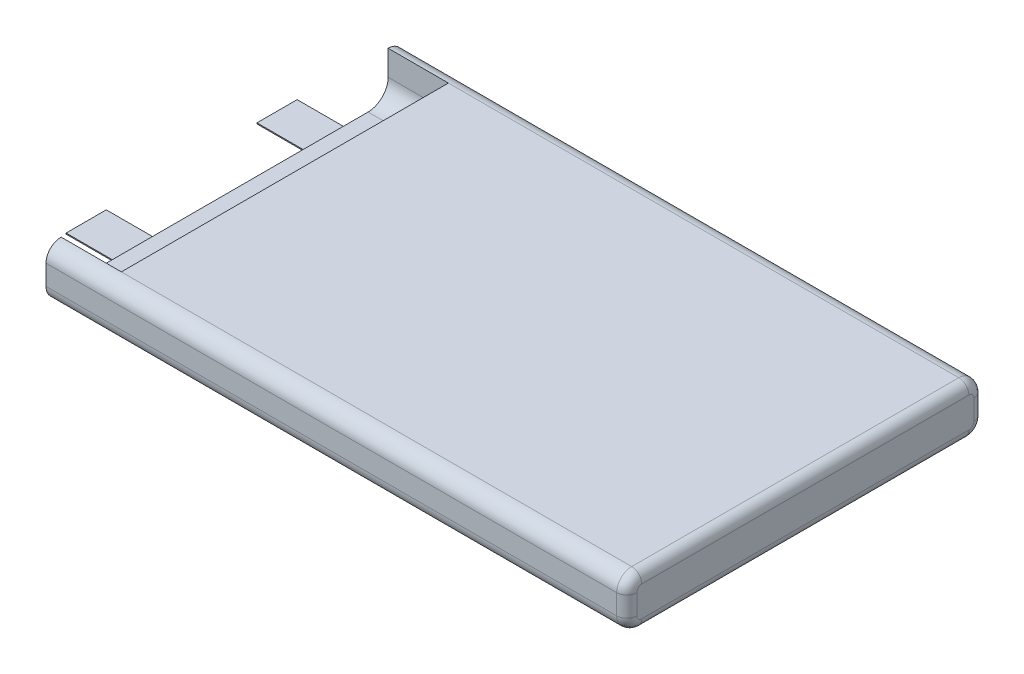
ISO-10303-21;
HEADER;
FILE_DESCRIPTION(('STEP AP214'),'2;1');
FILE_NAME('part.step','',(''),(''),'','','');
FILE_SCHEMA(('AUTOMOTIVE_DESIGN { 1 0 10303 214 1 1 1 1 }'));
ENDSEC;
DATA;
#1=APPLICATION_CONTEXT('core data for automotive mechanical design processes');
#2=APPLICATION_PROTOCOL_DEFINITION('international standard','automotive_design',2000,#1);
#3=PRODUCT_CONTEXT('',#1,'mechanical');
#4=PRODUCT('Part','Part','',(#3));
#5=PRODUCT_RELATED_PRODUCT_CATEGORY('part','',(#4));
#6=PRODUCT_DEFINITION_FORMATION('','',#4);
#7=PRODUCT_DEFINITION_CONTEXT('part definition',#1,'design');
#8=PRODUCT_DEFINITION('design','',#6,#7);
#9=PRODUCT_DEFINITION_SHAPE('','',#8);
#10=(LENGTH_UNIT() NAMED_UNIT(*) SI_UNIT(.MILLI.,.METRE.));
#11=(NAMED_UNIT(*) PLANE_ANGLE_UNIT() SI_UNIT($,.RADIAN.));
#12=(NAMED_UNIT(*) SI_UNIT($,.STERADIAN.) SOLID_ANGLE_UNIT());
#13=UNCERTAINTY_MEASURE_WITH_UNIT(LENGTH_MEASURE(1.E-05),#10,'distance_accuracy_value','');
#14=(GEOMETRIC_REPRESENTATION_CONTEXT(3) GLOBAL_UNCERTAINTY_ASSIGNED_CONTEXT((#13)) GLOBAL_UNIT_ASSIGNED_CONTEXT((#10,
#11,#12)) REPRESENTATION_CONTEXT('',''));
#15=CARTESIAN_POINT('',(0.,0.,0.));
#16=DIRECTION('',(0.,0.,1.));
#17=DIRECTION('',(1.,0.,0.));
#18=AXIS2_PLACEMENT_3D('',#15,#16,#17);
#19=CARTESIAN_POINT('',(0.,0.,6.78));
#20=DIRECTION('',(0.,-1.,0.));
#21=DIRECTION('',(0.,0.,-1.));
#22=AXIS2_PLACEMENT_3D('',#19,#20,#21);
#23=PLANE('',#22);
#24=DIRECTION('',(0.,0.,1.));
#25=VECTOR('',#24,1.);
#26=CARTESIAN_POINT('',(-5.,0.,6.78));
#27=LINE('',#26,#25);
#28=CARTESIAN_POINT('',(-5.,0.,6.78));
#29=VERTEX_POINT('',#28);
#30=CARTESIAN_POINT('',(-5.,0.,10.78));
#31=VERTEX_POINT('',#30);
#32=EDGE_CURVE('P0_E58',#29,#31,#27,.T.);
#33=ORIENTED_EDGE('',*,*,#32,.F.);
#34=DIRECTION('',(-1.,0.,0.));
#35=VECTOR('',#34,1.);
#36=CARTESIAN_POINT('',(0.,0.,6.78));
#37=LINE('',#36,#35);
#38=CARTESIAN_POINT('',(0.,0.,6.78));
#39=VERTEX_POINT('',#38);
#40=EDGE_CURVE('P0_E53',#39,#29,#37,.T.);
#41=ORIENTED_EDGE('',*,*,#40,.F.);
#42=DIRECTION('',(0.,0.,-1.));
#43=VECTOR('',#42,1.);
#44=CARTESIAN_POINT('',(0.,0.,6.78));
#45=LINE('',#44,#43);
#46=CARTESIAN_POINT('',(0.,0.,10.78));
#47=VERTEX_POINT('',#46);
#48=EDGE_CURVE('P0_E68',#47,#39,#45,.T.);
#49=ORIENTED_EDGE('',*,*,#48,.F.);
#50=DIRECTION('',(1.,0.,0.));
#51=VECTOR('',#50,1.);
#52=CARTESIAN_POINT('',(0.,0.,10.78));
#53=LINE('',#52,#51);
#54=EDGE_CURVE('P0_E20',#31,#47,#53,.T.);
#55=ORIENTED_EDGE('',*,*,#54,.F.);
#56=EDGE_LOOP('',(#33,#41,#49,#55));
#57=FACE_BOUND('',#56,.T.);
#58=ADVANCED_FACE('P0_F17',(#57),#23,.T.);
#59=CARTESIAN_POINT('',(0.,0.1,10.78));
#60=DIRECTION('',(0.,0.,1.));
#61=DIRECTION('',(1.,0.,0.));
#62=AXIS2_PLACEMENT_3D('',#59,#60,#61);
#63=PLANE('',#62);
#64=DIRECTION('',(1.,0.,0.));
#65=VECTOR('',#64,1.);
#66=CARTESIAN_POINT('',(0.,0.1,10.78));
#67=LINE('',#66,#65);
#68=CARTESIAN_POINT('',(0.,0.1,10.78));
#69=VERTEX_POINT('',#68);
#70=CARTESIAN_POINT('',(-5.,0.1,10.78));
#71=VERTEX_POINT('',#70);
#72=EDGE_CURVE('P0_E74',#69,#71,#67,.F.);
#73=ORIENTED_EDGE('',*,*,#72,.T.);
#74=DIRECTION('',(0.,1.,0.));
#75=VECTOR('',#74,1.);
#76=CARTESIAN_POINT('',(-5.,0.1,10.78));
#77=LINE('',#76,#75);
#78=EDGE_CURVE('P0_E63',#31,#71,#77,.T.);
#79=ORIENTED_EDGE('',*,*,#78,.F.);
#80=ORIENTED_EDGE('',*,*,#54,.T.);
#81=DIRECTION('',(0.,1.,0.));
#82=VECTOR('',#81,1.);
#83=CARTESIAN_POINT('',(0.,0.1,10.78));
#84=LINE('',#83,#82);
#85=EDGE_CURVE('P0_E81',#69,#47,#84,.F.);
#86=ORIENTED_EDGE('',*,*,#85,.F.);
#87=EDGE_LOOP('',(#73,#79,#80,#86));
#88=FACE_BOUND('',#87,.T.);
#89=ADVANCED_FACE('P0_F73',(#88),#63,.T.);
#90=CARTESIAN_POINT('',(-5.,0.1,6.78));
#91=DIRECTION('',(-1.,0.,0.));
#92=DIRECTION('',(0.,0.,1.));
#93=AXIS2_PLACEMENT_3D('',#90,#91,#92);
#94=PLANE('',#93);
#95=DIRECTION('',(0.,0.,-1.));
#96=VECTOR('',#95,1.);
#97=CARTESIAN_POINT('',(-5.,0.1,6.78));
#98=LINE('',#97,#96);
#99=CARTESIAN_POINT('',(-5.,0.1,6.78));
#100=VERTEX_POINT('',#99);
#101=EDGE_CURVE('P0_E84',#71,#100,#98,.T.);
#102=ORIENTED_EDGE('',*,*,#101,.T.);
#103=DIRECTION('',(0.,1.,0.));
#104=VECTOR('',#103,1.);
#105=CARTESIAN_POINT('',(-5.,0.1,6.78));
#106=LINE('',#105,#104);
#107=EDGE_CURVE('P0_E65',#29,#100,#106,.T.);
#108=ORIENTED_EDGE('',*,*,#107,.F.);
#109=ORIENTED_EDGE('',*,*,#32,.T.);
#110=ORIENTED_EDGE('',*,*,#78,.T.);
#111=EDGE_LOOP('',(#102,#108,#109,#110));
#112=FACE_BOUND('',#111,.T.);
#113=ADVANCED_FACE('P0_F61',(#112),#94,.T.);
#114=CARTESIAN_POINT('',(0.,0.1,6.78));
#115=DIRECTION('',(0.,0.,-1.));
#116=DIRECTION('',(-1.,0.,0.));
#117=AXIS2_PLACEMENT_3D('',#114,#115,#116);
#118=PLANE('',#117);
#119=DIRECTION('',(1.,0.,0.));
#120=VECTOR('',#119,1.);
#121=CARTESIAN_POINT('',(0.,0.1,6.78));
#122=LINE('',#121,#120);
#123=CARTESIAN_POINT('',(0.,0.1,6.78));
#124=VERTEX_POINT('',#123);
#125=EDGE_CURVE('P0_E26',#100,#124,#122,.T.);
#126=ORIENTED_EDGE('',*,*,#125,.T.);
#127=DIRECTION('',(0.,1.,0.));
#128=VECTOR('',#127,1.);
#129=CARTESIAN_POINT('',(0.,0.1,6.78));
#130=LINE('',#129,#128);
#131=EDGE_CURVE('P0_E34',#39,#124,#130,.T.);
#132=ORIENTED_EDGE('',*,*,#131,.F.);
#133=ORIENTED_EDGE('',*,*,#40,.T.);
#134=ORIENTED_EDGE('',*,*,#107,.T.);
#135=EDGE_LOOP('',(#126,#132,#133,#134));
#136=FACE_BOUND('',#135,.T.);
#137=ADVANCED_FACE('P0_F88',(#136),#118,.T.);
#138=CARTESIAN_POINT('',(0.,0.1,6.78));
#139=DIRECTION('',(1.,0.,0.));
#140=DIRECTION('',(0.,0.,-1.));
#141=AXIS2_PLACEMENT_3D('',#138,#139,#140);
#142=PLANE('',#141);
#143=DIRECTION('',(0.,0.,-1.));
#144=VECTOR('',#143,1.);
#145=CARTESIAN_POINT('',(0.,0.1,6.78));
#146=LINE('',#145,#144);
#147=EDGE_CURVE('P0_E11',#124,#69,#146,.F.);
#148=ORIENTED_EDGE('',*,*,#147,.T.);
#149=ORIENTED_EDGE('',*,*,#85,.T.);
#150=ORIENTED_EDGE('',*,*,#48,.T.);
#151=ORIENTED_EDGE('',*,*,#131,.T.);
#152=EDGE_LOOP('',(#148,#149,#150,#151));
#153=FACE_BOUND('',#152,.T.);
#154=ADVANCED_FACE('P0_F91',(#153),#142,.T.);
#155=CARTESIAN_POINT('',(0.,0.1,6.78));
#156=DIRECTION('',(0.,-1.,0.));
#157=DIRECTION('',(0.,0.,-1.));
#158=AXIS2_PLACEMENT_3D('',#155,#156,#157);
#159=PLANE('',#158);
#160=ORIENTED_EDGE('',*,*,#125,.F.);
#161=ORIENTED_EDGE('',*,*,#101,.F.);
#162=ORIENTED_EDGE('',*,*,#72,.F.);
#163=ORIENTED_EDGE('',*,*,#147,.F.);
#164=EDGE_LOOP('',(#160,#161,#162,#163));
#165=FACE_BOUND('',#164,.T.);
#166=ADVANCED_FACE('P0_F90',(#165),#159,.F.);
#167=CLOSED_SHELL('',(#58,#89,#113,#137,#154,#166));
#168=MANIFOLD_SOLID_BREP('P0_B1',#167);
#169=CARTESIAN_POINT('',(56.81,3.5,16.78));
#170=DIRECTION('',(0.,1.,0.));
#171=DIRECTION('',(0.,0.,1.));
#172=AXIS2_PLACEMENT_3D('',#169,#170,#171);
#173=CIRCLE('',#172,1.);
#174=TRIMMED_CURVE('',#173,(PARAMETER_VALUE(-2.0943951023932)),
(PARAMETER_VALUE(2.0943951023932)),.T.,.PARAMETER.);
#175=CARTESIAN_POINT('',(56.81,3.5,16.28));
#176=DIRECTION('',(-1.,0.,0.));
#177=AXIS1_PLACEMENT('',#175,#176);
#178=SURFACE_OF_REVOLUTION('',#174,#177);
#179=CARTESIAN_POINT('',(56.81,3.5,16.78));
#180=DIRECTION('',(0.,-1.,0.));
#181=DIRECTION('',(0.,0.,-1.));
#182=AXIS2_PLACEMENT_3D('',#179,#180,#181);
#183=CIRCLE('',#182,1.);
#184=CARTESIAN_POINT('',(57.81,3.5,16.78));
#185=VERTEX_POINT('',#184);
#186=CARTESIAN_POINT('',(56.81,3.5,17.78));
#187=VERTEX_POINT('',#186);
#188=EDGE_CURVE('P1_E174',#185,#187,#183,.T.);
#189=ORIENTED_EDGE('',*,*,#188,.F.);
#190=CARTESIAN_POINT('',(57.81,3.5,16.28));
#191=DIRECTION('',(-1.,0.,0.));
#192=DIRECTION('',(0.,0.,1.));
#193=AXIS2_PLACEMENT_3D('',#190,#191,#192);
#194=CIRCLE('',#193,0.5);
#195=CARTESIAN_POINT('',(57.81,4.,16.28));
#196=VERTEX_POINT('',#195);
#197=EDGE_CURVE('P1_E212',#185,#196,#194,.T.);
#198=ORIENTED_EDGE('',*,*,#197,.T.);
#199=CARTESIAN_POINT('',(56.81,4.,16.28));
#200=DIRECTION('',(0.,0.,1.));
#201=DIRECTION('',(1.,0.,0.));
#202=AXIS2_PLACEMENT_3D('',#199,#200,#201);
#203=CIRCLE('',#202,1.);
#204=CARTESIAN_POINT('',(56.81,5.,16.28));
#205=VERTEX_POINT('',#204);
#206=EDGE_CURVE('P1_E746',#205,#196,#203,.F.);
#207=ORIENTED_EDGE('',*,*,#206,.F.);
#208=CARTESIAN_POINT('',(56.81,3.5,16.28));
#209=DIRECTION('',(-1.,0.,0.));
#210=DIRECTION('',(0.,0.,1.));
#211=AXIS2_PLACEMENT_3D('',#208,#209,#210);
#212=CIRCLE('',#211,1.5);
#213=EDGE_CURVE('P1_E411',#187,#205,#212,.T.);
#214=ORIENTED_EDGE('',*,*,#213,.F.);
#215=EDGE_LOOP('',(#189,#198,#207,#214));
#216=FACE_BOUND('',#215,.T.);
#217=ADVANCED_FACE('P1_F17',(#216),#178,.F.);
#218=CARTESIAN_POINT('',(0.,5.,17.78));
#219=DIRECTION('',(0.,1.,0.));
#220=DIRECTION('',(0.,0.,1.));
#221=AXIS2_PLACEMENT_3D('',#218,#219,#220);
#222=PLANE('',#221);
#223=DIRECTION('',(1.,0.,0.));
#224=VECTOR('',#223,1.);
#225=CARTESIAN_POINT('',(0.,5.,-16.28));
#226=LINE('',#225,#224);
#227=CARTESIAN_POINT('',(6.00000000000001,5.,-16.28));
#228=VERTEX_POINT('',#227);
#229=CARTESIAN_POINT('',(56.81,5.,-16.28));
#230=VERTEX_POINT('',#229);
#231=EDGE_CURVE('P1_E178',#228,#230,#226,.T.);
#232=ORIENTED_EDGE('',*,*,#231,.F.);
#233=DIRECTION('',(0.,0.,-1.));
#234=VECTOR('',#233,1.);
#235=CARTESIAN_POINT('',(6.,5.,-16.28));
#236=LINE('',#235,#234);
#237=CARTESIAN_POINT('',(6.00000000000001,5.,16.28));
#238=VERTEX_POINT('',#237);
#239=EDGE_CURVE('P1_E172',#228,#238,#236,.F.);
#240=ORIENTED_EDGE('',*,*,#239,.T.);
#241=DIRECTION('',(-1.,0.,0.));
#242=VECTOR('',#241,1.);
#243=CARTESIAN_POINT('',(0.,5.,16.28));
#244=LINE('',#243,#242);
#245=EDGE_CURVE('P1_E268',#205,#238,#244,.T.);
#246=ORIENTED_EDGE('',*,*,#245,.F.);
#247=DIRECTION('',(0.,0.,1.));
#248=VECTOR('',#247,1.);
#249=CARTESIAN_POINT('',(56.81,5.,17.78));
#250=LINE('',#249,#248);
#251=EDGE_CURVE('P1_E754',#230,#205,#250,.T.);
#252=ORIENTED_EDGE('',*,*,#251,.F.);
#253=EDGE_LOOP('',(#232,#240,#246,#252));
#254=FACE_BOUND('',#253,.T.);
#255=ADVANCED_FACE('P1_F194',(#254),#222,.T.);
#256=CARTESIAN_POINT('',(56.81,3.5,-15.78));
#257=DIRECTION('',(0.,1.,0.));
#258=DIRECTION('',(0.,0.,1.));
#259=AXIS2_PLACEMENT_3D('',#256,#257,#258);
#260=CIRCLE('',#259,1.);
#261=TRIMMED_CURVE('',#260,(PARAMETER_VALUE(-2.0943951023932)),
(PARAMETER_VALUE(2.0943951023932)),.T.,.PARAMETER.);
#262=CARTESIAN_POINT('',(56.81,3.5,-16.28));
#263=DIRECTION('',(-1.,0.,0.));
#264=AXIS1_PLACEMENT('',#262,#263);
#265=SURFACE_OF_REVOLUTION('',#261,#264);
#266=CARTESIAN_POINT('',(56.81,4.,-16.28));
#267=DIRECTION('',(0.,0.,1.));
#268=DIRECTION('',(1.,0.,0.));
#269=AXIS2_PLACEMENT_3D('',#266,#267,#268);
#270=CIRCLE('',#269,1.);
#271=CARTESIAN_POINT('',(57.81,4.,-16.28));
#272=VERTEX_POINT('',#271);
#273=EDGE_CURVE('P1_E739',#272,#230,#270,.T.);
#274=ORIENTED_EDGE('',*,*,#273,.F.);
#275=CARTESIAN_POINT('',(57.81,3.5,-16.28));
#276=DIRECTION('',(-1.,0.,0.));
#277=DIRECTION('',(0.,1.,0.));
#278=AXIS2_PLACEMENT_3D('',#275,#276,#277);
#279=CIRCLE('',#278,0.5);
#280=CARTESIAN_POINT('',(57.81,3.5,-16.78));
#281=VERTEX_POINT('',#280);
#282=EDGE_CURVE('P1_E175',#272,#281,#279,.T.);
#283=ORIENTED_EDGE('',*,*,#282,.T.);
#284=CARTESIAN_POINT('',(56.81,3.5,-16.78));
#285=DIRECTION('',(0.,-1.,0.));
#286=DIRECTION('',(0.,0.,-1.));
#287=AXIS2_PLACEMENT_3D('',#284,#285,#286);
#288=CIRCLE('',#287,1.);
#289=CARTESIAN_POINT('',(56.81,3.5,-17.78));
#290=VERTEX_POINT('',#289);
#291=EDGE_CURVE('P1_E146',#290,#281,#288,.T.);
#292=ORIENTED_EDGE('',*,*,#291,.F.);
#293=CARTESIAN_POINT('',(56.81,3.5,-16.28));
#294=DIRECTION('',(1.,0.,0.));
#295=DIRECTION('',(0.,0.,-1.));
#296=AXIS2_PLACEMENT_3D('',#293,#294,#295);
#297=CIRCLE('',#296,1.5);
#298=EDGE_CURVE('P1_E181',#230,#290,#297,.F.);
#299=ORIENTED_EDGE('',*,*,#298,.F.);
#300=EDGE_LOOP('',(#274,#283,#292,#299));
#301=FACE_BOUND('',#300,.T.);
#302=ADVANCED_FACE('P1_F190',(#301),#265,.F.);
#303=CARTESIAN_POINT('',(6.,0.5,-16.28));
#304=DIRECTION('',(1.,0.,0.));
#305=DIRECTION('',(0.,0.,-1.));
#306=AXIS2_PLACEMENT_3D('',#303,#304,#305);
#307=PLANE('',#306);
#308=CARTESIAN_POINT('',(6.00000000000001,2.5,14.28));
#309=DIRECTION('',(1.,0.,0.));
#310=DIRECTION('',(0.,0.,-1.));
#311=AXIS2_PLACEMENT_3D('',#308,#309,#310);
#312=CIRCLE('',#311,2.);
#313=CARTESIAN_POINT('',(6.00000000000001,0.5,14.28));
#314=VERTEX_POINT('',#313);
#315=CARTESIAN_POINT('',(6.00000000000001,2.5,16.28));
#316=VERTEX_POINT('',#315);
#317=EDGE_CURVE('P1_E22',#314,#316,#312,.F.);
#318=ORIENTED_EDGE('',*,*,#317,.T.);
#319=DIRECTION('',(0.,1.,0.));
#320=VECTOR('',#319,1.);
#321=CARTESIAN_POINT('',(6.00000000000001,0.5,16.28));
#322=LINE('',#321,#320);
#323=EDGE_CURVE('P1_E187',#316,#238,#322,.T.);
#324=ORIENTED_EDGE('',*,*,#323,.T.);
#325=ORIENTED_EDGE('',*,*,#239,.F.);
#326=DIRECTION('',(0.,1.,0.));
#327=VECTOR('',#326,1.);
#328=CARTESIAN_POINT('',(6.00000000000001,0.5,-16.28));
#329=LINE('',#328,#327);
#330=CARTESIAN_POINT('',(6.,2.5,-16.28));
#331=VERTEX_POINT('',#330);
#332=EDGE_CURVE('P1_E166',#228,#331,#329,.F.);
#333=ORIENTED_EDGE('',*,*,#332,.T.);
#334=CARTESIAN_POINT('',(6.,2.5,-14.28));
#335=DIRECTION('',(-1.,0.,0.));
#336=DIRECTION('',(0.,0.,1.));
#337=AXIS2_PLACEMENT_3D('',#334,#335,#336);
#338=CIRCLE('',#337,2.);
#339=CARTESIAN_POINT('',(6.00000000000001,0.5,-14.28));
#340=VERTEX_POINT('',#339);
#341=EDGE_CURVE('P1_E153',#331,#340,#338,.T.);
#342=ORIENTED_EDGE('',*,*,#341,.T.);
#343=DIRECTION('',(0.,0.,1.));
#344=VECTOR('',#343,1.);
#345=CARTESIAN_POINT('',(6.00000000000001,0.5,16.28));
#346=LINE('',#345,#344);
#347=EDGE_CURVE('P1_E149',#314,#340,#346,.F.);
#348=ORIENTED_EDGE('',*,*,#347,.F.);
#349=EDGE_LOOP('',(#318,#324,#325,#333,#342,#348));
#350=FACE_BOUND('',#349,.T.);
#351=ADVANCED_FACE('P1_F155',(#350),#307,.F.);
#352=CARTESIAN_POINT('',(56.81,5.,16.78));
#353=DIRECTION('',(0.,-1.,0.));
#354=DIRECTION('',(0.,0.,-1.));
#355=AXIS2_PLACEMENT_3D('',#352,#353,#354);
#356=CYLINDRICAL_SURFACE('',#355,1.);
#357=ORIENTED_EDGE('',*,*,#188,.T.);
#358=DIRECTION('',(0.,1.,0.));
#359=VECTOR('',#358,1.);
#360=CARTESIAN_POINT('',(56.81,5.,17.78));
#361=LINE('',#360,#359);
#362=CARTESIAN_POINT('',(56.81,1.5,17.78));
#363=VERTEX_POINT('',#362);
#364=EDGE_CURVE('P1_E263',#187,#363,#361,.F.);
#365=ORIENTED_EDGE('',*,*,#364,.T.);
#366=CARTESIAN_POINT('',(56.81,1.5,16.78));
#367=DIRECTION('',(0.,1.,0.));
#368=DIRECTION('',(0.,0.,1.));
#369=AXIS2_PLACEMENT_3D('',#366,#367,#368);
#370=CIRCLE('',#369,1.);
#371=CARTESIAN_POINT('',(57.81,1.5,16.78));
#372=VERTEX_POINT('',#371);
#373=EDGE_CURVE('P1_E264',#372,#363,#370,.F.);
#374=ORIENTED_EDGE('',*,*,#373,.F.);
#375=DIRECTION('',(0.,1.,0.));
#376=VECTOR('',#375,1.);
#377=CARTESIAN_POINT('',(57.81,5.,16.78));
#378=LINE('',#377,#376);
#379=EDGE_CURVE('P1_E358',#372,#185,#378,.T.);
#380=ORIENTED_EDGE('',*,*,#379,.T.);
#381=EDGE_LOOP('',(#357,#365,#374,#380));
#382=FACE_BOUND('',#381,.T.);
#383=ADVANCED_FACE('P1_F471',(#382),#356,.T.);
#384=CARTESIAN_POINT('',(56.81,4.,17.78));
#385=DIRECTION('',(0.,0.,1.));
#386=DIRECTION('',(1.,0.,0.));
#387=AXIS2_PLACEMENT_3D('',#384,#385,#386);
#388=CYLINDRICAL_SURFACE('',#387,1.);
#389=ORIENTED_EDGE('',*,*,#206,.T.);
#390=DIRECTION('',(0.,0.,1.));
#391=VECTOR('',#390,1.);
#392=CARTESIAN_POINT('',(57.81,4.,-17.78));
#393=LINE('',#392,#391);
#394=EDGE_CURVE('P1_E303',#196,#272,#393,.F.);
#395=ORIENTED_EDGE('',*,*,#394,.T.);
#396=ORIENTED_EDGE('',*,*,#273,.T.);
#397=ORIENTED_EDGE('',*,*,#251,.T.);
#398=EDGE_LOOP('',(#389,#395,#396,#397));
#399=FACE_BOUND('',#398,.T.);
#400=ADVANCED_FACE('P1_F587',(#399),#388,.T.);
#401=CARTESIAN_POINT('',(56.81,5.,-16.78));
#402=DIRECTION('',(0.,-1.,0.));
#403=DIRECTION('',(0.,0.,-1.));
#404=AXIS2_PLACEMENT_3D('',#401,#402,#403);
#405=CYLINDRICAL_SURFACE('',#404,1.);
#406=ORIENTED_EDGE('',*,*,#291,.T.);
#407=DIRECTION('',(0.,1.,0.));
#408=VECTOR('',#407,1.);
#409=CARTESIAN_POINT('',(57.81,5.,-16.78));
#410=LINE('',#409,#408);
#411=CARTESIAN_POINT('',(57.81,1.5,-16.78));
#412=VERTEX_POINT('',#411);
#413=EDGE_CURVE('P1_E366',#281,#412,#410,.F.);
#414=ORIENTED_EDGE('',*,*,#413,.T.);
#415=CARTESIAN_POINT('',(56.81,1.5,-16.78));
#416=DIRECTION('',(0.,-1.,0.));
#417=DIRECTION('',(0.,0.,-1.));
#418=AXIS2_PLACEMENT_3D('',#415,#416,#417);
#419=CIRCLE('',#418,1.);
#420=CARTESIAN_POINT('',(56.81,1.5,-17.78));
#421=VERTEX_POINT('',#420);
#422=EDGE_CURVE('P1_E456',#412,#421,#419,.F.);
#423=ORIENTED_EDGE('',*,*,#422,.T.);
#424=DIRECTION('',(0.,1.,0.));
#425=VECTOR('',#424,1.);
#426=CARTESIAN_POINT('',(56.81,5.,-17.78));
#427=LINE('',#426,#425);
#428=EDGE_CURVE('P1_E257',#421,#290,#427,.T.);
#429=ORIENTED_EDGE('',*,*,#428,.T.);
#430=EDGE_LOOP('',(#406,#414,#423,#429));
#431=FACE_BOUND('',#430,.T.);
#432=ADVANCED_FACE('P1_F578',(#431),#405,.T.);
#433=CARTESIAN_POINT('',(-3.77909473636814,2.5,14.28));
#434=DIRECTION('',(1.,0.,0.));
#435=DIRECTION('',(0.,0.,-1.));
#436=AXIS2_PLACEMENT_3D('',#433,#434,#435);
#437=CYLINDRICAL_SURFACE('',#436,2.);
#438=DIRECTION('',(1.,0.,0.));
#439=VECTOR('',#438,1.);
#440=CARTESIAN_POINT('',(-3.77909473636814,2.5,16.28));
#441=LINE('',#440,#439);
#442=CARTESIAN_POINT('',(0.,2.5,16.28));
#443=VERTEX_POINT('',#442);
#444=EDGE_CURVE('P1_E141',#443,#316,#441,.T.);
#445=ORIENTED_EDGE('',*,*,#444,.T.);
#446=ORIENTED_EDGE('',*,*,#317,.F.);
#447=DIRECTION('',(1.,0.,0.));
#448=VECTOR('',#447,1.);
#449=CARTESIAN_POINT('',(-3.77909473636814,0.5,14.28));
#450=LINE('',#449,#448);
#451=CARTESIAN_POINT('',(0.,0.5,14.28));
#452=VERTEX_POINT('',#451);
#453=EDGE_CURVE('P1_E139',#452,#314,#450,.T.);
#454=ORIENTED_EDGE('',*,*,#453,.F.);
#455=CARTESIAN_POINT('',(0.,2.5,14.28));
#456=DIRECTION('',(1.,0.,0.));
#457=DIRECTION('',(0.,0.,-1.));
#458=AXIS2_PLACEMENT_3D('',#455,#456,#457);
#459=CIRCLE('',#458,2.);
#460=EDGE_CURVE('P1_E243',#452,#443,#459,.F.);
#461=ORIENTED_EDGE('',*,*,#460,.T.);
#462=EDGE_LOOP('',(#445,#446,#454,#461));
#463=FACE_BOUND('',#462,.T.);
#464=ADVANCED_FACE('P1_F137',(#463),#437,.F.);
#465=CARTESIAN_POINT('',(-3.77909473636814,0.5,16.28));
#466=DIRECTION('',(0.,0.,1.));
#467=DIRECTION('',(1.,0.,0.));
#468=AXIS2_PLACEMENT_3D('',#465,#466,#467);
#469=PLANE('',#468);
#470=ORIENTED_EDGE('',*,*,#444,.F.);
#471=DIRECTION('',(0.,1.,0.));
#472=VECTOR('',#471,1.);
#473=CARTESIAN_POINT('',(0.,5.,16.28));
#474=LINE('',#473,#472);
#475=CARTESIAN_POINT('',(0.,5.,16.28));
#476=VERTEX_POINT('',#475);
#477=EDGE_CURVE('P1_E242',#443,#476,#474,.T.);
#478=ORIENTED_EDGE('',*,*,#477,.T.);
#479=DIRECTION('',(-1.,0.,0.));
#480=VECTOR('',#479,1.);
#481=CARTESIAN_POINT('',(0.,5.,16.28));
#482=LINE('',#481,#480);
#483=EDGE_CURVE('P1_E182',#238,#476,#482,.T.);
#484=ORIENTED_EDGE('',*,*,#483,.F.);
#485=ORIENTED_EDGE('',*,*,#323,.F.);
#486=EDGE_LOOP('',(#470,#478,#484,#485));
#487=FACE_BOUND('',#486,.T.);
#488=ADVANCED_FACE('P1_F426',(#487),#469,.F.);
#489=CARTESIAN_POINT('',(0.,3.5,16.28));
#490=DIRECTION('',(-1.,0.,0.));
#491=DIRECTION('',(0.,0.,1.));
#492=AXIS2_PLACEMENT_3D('',#489,#490,#491);
#493=CYLINDRICAL_SURFACE('',#492,1.5);
#494=ORIENTED_EDGE('',*,*,#483,.T.);
#495=CARTESIAN_POINT('',(0.,3.5,16.28));
#496=DIRECTION('',(-1.,0.,0.));
#497=DIRECTION('',(0.,0.,1.));
#498=AXIS2_PLACEMENT_3D('',#495,#496,#497);
#499=CIRCLE('',#498,1.5);
#500=CARTESIAN_POINT('',(0.,3.5,17.78));
#501=VERTEX_POINT('',#500);
#502=EDGE_CURVE('P1_E238',#476,#501,#499,.F.);
#503=ORIENTED_EDGE('',*,*,#502,.T.);
#504=DIRECTION('',(-1.,0.,0.));
#505=VECTOR('',#504,1.);
#506=CARTESIAN_POINT('',(0.,3.5,17.78));
#507=LINE('',#506,#505);
#508=EDGE_CURVE('P1_E260',#501,#187,#507,.F.);
#509=ORIENTED_EDGE('',*,*,#508,.T.);
#510=ORIENTED_EDGE('',*,*,#213,.T.);
#511=ORIENTED_EDGE('',*,*,#245,.T.);
#512=EDGE_LOOP('',(#494,#503,#509,#510,#511));
#513=FACE_BOUND('',#512,.T.);
#514=ADVANCED_FACE('P1_F429',(#513),#493,.T.);
#515=CARTESIAN_POINT('',(0.,3.5,-16.28));
#516=DIRECTION('',(1.,0.,0.));
#517=DIRECTION('',(0.,0.,-1.));
#518=AXIS2_PLACEMENT_3D('',#515,#516,#517);
#519=CYLINDRICAL_SURFACE('',#518,1.5);
#520=CARTESIAN_POINT('',(0.,3.5,-16.28));
#521=DIRECTION('',(1.,0.,0.));
#522=DIRECTION('',(0.,0.,-1.));
#523=AXIS2_PLACEMENT_3D('',#520,#521,#522);
#524=CIRCLE('',#523,1.5);
#525=CARTESIAN_POINT('',(0.,3.5,-17.78));
#526=VERTEX_POINT('',#525);
#527=CARTESIAN_POINT('',(0.,5.,-16.28));
#528=VERTEX_POINT('',#527);
#529=EDGE_CURVE('P1_E234',#526,#528,#524,.T.);
#530=ORIENTED_EDGE('',*,*,#529,.T.);
#531=DIRECTION('',(-1.,0.,0.));
#532=VECTOR('',#531,1.);
#533=CARTESIAN_POINT('',(-3.77909473636814,5.,-16.28));
#534=LINE('',#533,#532);
#535=EDGE_CURVE('P1_E169',#528,#228,#534,.F.);
#536=ORIENTED_EDGE('',*,*,#535,.T.);
#537=ORIENTED_EDGE('',*,*,#231,.T.);
#538=ORIENTED_EDGE('',*,*,#298,.T.);
#539=DIRECTION('',(1.,0.,0.));
#540=VECTOR('',#539,1.);
#541=CARTESIAN_POINT('',(0.,3.5,-17.78));
#542=LINE('',#541,#540);
#543=EDGE_CURVE('P1_E255',#290,#526,#542,.F.);
#544=ORIENTED_EDGE('',*,*,#543,.T.);
#545=EDGE_LOOP('',(#530,#536,#537,#538,#544));
#546=FACE_BOUND('',#545,.T.);
#547=ADVANCED_FACE('P1_F544',(#546),#519,.T.);
#548=CARTESIAN_POINT('',(-3.77909473636814,0.5,-16.28));
#549=DIRECTION('',(0.,0.,-1.));
#550=DIRECTION('',(-1.,0.,0.));
#551=AXIS2_PLACEMENT_3D('',#548,#549,#550);
#552=PLANE('',#551);
#553=DIRECTION('',(-1.,0.,0.));
#554=VECTOR('',#553,1.);
#555=CARTESIAN_POINT('',(-3.77909473636814,2.5,-16.28));
#556=LINE('',#555,#554);
#557=CARTESIAN_POINT('',(0.,2.5,-16.28));
#558=VERTEX_POINT('',#557);
#559=EDGE_CURVE('P1_E168',#558,#331,#556,.F.);
#560=ORIENTED_EDGE('',*,*,#559,.T.);
#561=ORIENTED_EDGE('',*,*,#332,.F.);
#562=ORIENTED_EDGE('',*,*,#535,.F.);
#563=DIRECTION('',(0.,1.,0.));
#564=VECTOR('',#563,1.);
#565=CARTESIAN_POINT('',(0.,5.,-16.28));
#566=LINE('',#565,#564);
#567=EDGE_CURVE('P1_E233',#528,#558,#566,.F.);
#568=ORIENTED_EDGE('',*,*,#567,.T.);
#569=EDGE_LOOP('',(#560,#561,#562,#568));
#570=FACE_BOUND('',#569,.T.);
#571=ADVANCED_FACE('P1_F535',(#570),#552,.F.);
#572=CARTESIAN_POINT('',(-3.77909473636814,2.5,-14.28));
#573=DIRECTION('',(-1.,0.,0.));
#574=DIRECTION('',(0.,0.,1.));
#575=AXIS2_PLACEMENT_3D('',#572,#573,#574);
#576=CYLINDRICAL_SURFACE('',#575,2.);
#577=ORIENTED_EDGE('',*,*,#559,.F.);
#578=CARTESIAN_POINT('',(0.,2.5,-14.28));
#579=DIRECTION('',(-1.,0.,0.));
#580=DIRECTION('',(0.,0.,1.));
#581=AXIS2_PLACEMENT_3D('',#578,#579,#580);
#582=CIRCLE('',#581,2.);
#583=CARTESIAN_POINT('',(0.,0.5,-14.28));
#584=VERTEX_POINT('',#583);
#585=EDGE_CURVE('P1_E230',#558,#584,#582,.T.);
#586=ORIENTED_EDGE('',*,*,#585,.T.);
#587=DIRECTION('',(1.,0.,0.));
#588=VECTOR('',#587,1.);
#589=CARTESIAN_POINT('',(-3.77909473636814,0.5,-14.28));
#590=LINE('',#589,#588);
#591=EDGE_CURVE('P1_E158',#340,#584,#590,.F.);
#592=ORIENTED_EDGE('',*,*,#591,.F.);
#593=ORIENTED_EDGE('',*,*,#341,.F.);
#594=EDGE_LOOP('',(#577,#586,#592,#593));
#595=FACE_BOUND('',#594,.T.);
#596=ADVANCED_FACE('P1_F527',(#595),#576,.F.);
#597=CARTESIAN_POINT('',(-3.77909473636814,0.5,16.28));
#598=DIRECTION('',(0.,1.,0.));
#599=DIRECTION('',(0.,0.,1.));
#600=AXIS2_PLACEMENT_3D('',#597,#598,#599);
#601=PLANE('',#600);
#602=ORIENTED_EDGE('',*,*,#347,.T.);
#603=ORIENTED_EDGE('',*,*,#591,.T.);
#604=DIRECTION('',(0.,0.,-1.));
#605=VECTOR('',#604,1.);
#606=CARTESIAN_POINT('',(0.,0.5,-17.78));
#607=LINE('',#606,#605);
#608=EDGE_CURVE('P1_E152',#584,#452,#607,.F.);
#609=ORIENTED_EDGE('',*,*,#608,.T.);
#610=ORIENTED_EDGE('',*,*,#453,.T.);
#611=EDGE_LOOP('',(#602,#603,#609,#610));
#612=FACE_BOUND('',#611,.T.);
#613=ADVANCED_FACE('P1_F148',(#612),#601,.T.);
#614=CARTESIAN_POINT('',(56.81,1.5,16.78));
#615=DIRECTION('',(0.,1.,0.));
#616=DIRECTION('',(0.,0.,1.));
#617=AXIS2_PLACEMENT_3D('',#614,#615,#616);
#618=CIRCLE('',#617,1.);
#619=TRIMMED_CURVE('',#618,(PARAMETER_VALUE(-2.0943951023932)),
(PARAMETER_VALUE(2.0943951023932)),.T.,.PARAMETER.);
#620=CARTESIAN_POINT('',(56.81,1.5,16.28));
#621=DIRECTION('',(-1.,0.,0.));
#622=AXIS1_PLACEMENT('',#620,#621);
#623=SURFACE_OF_REVOLUTION('',#619,#622);
#624=ORIENTED_EDGE('',*,*,#373,.T.);
#625=CARTESIAN_POINT('',(56.81,1.5,16.28));
#626=DIRECTION('',(1.,0.,0.));
#627=DIRECTION('',(0.,0.,-1.));
#628=AXIS2_PLACEMENT_3D('',#625,#626,#627);
#629=CIRCLE('',#628,1.5);
#630=CARTESIAN_POINT('',(56.81,0.,16.28));
#631=VERTEX_POINT('',#630);
#632=EDGE_CURVE('P1_E385',#631,#363,#629,.F.);
#633=ORIENTED_EDGE('',*,*,#632,.F.);
#634=CARTESIAN_POINT('',(56.81,1.,16.28));
#635=DIRECTION('',(0.,0.,1.));
#636=DIRECTION('',(0.,-1.,0.));
#637=AXIS2_PLACEMENT_3D('',#634,#635,#636);
#638=CIRCLE('',#637,1.);
#639=CARTESIAN_POINT('',(57.81,1.,16.28));
#640=VERTEX_POINT('',#639);
#641=EDGE_CURVE('P1_E160',#631,#640,#638,.T.);
#642=ORIENTED_EDGE('',*,*,#641,.T.);
#643=CARTESIAN_POINT('',(57.81,1.5,16.28));
#644=DIRECTION('',(-1.,0.,0.));
#645=DIRECTION('',(0.,-1.,0.));
#646=AXIS2_PLACEMENT_3D('',#643,#644,#645);
#647=CIRCLE('',#646,0.5);
#648=EDGE_CURVE('P1_E363',#640,#372,#647,.T.);
#649=ORIENTED_EDGE('',*,*,#648,.T.);
#650=EDGE_LOOP('',(#624,#633,#642,#649));
#651=FACE_BOUND('',#650,.T.);
#652=ADVANCED_FACE('P1_F399',(#651),#623,.F.);
#653=CARTESIAN_POINT('',(0.,5.,17.78));
#654=DIRECTION('',(0.,0.,-1.));
#655=DIRECTION('',(-1.,0.,0.));
#656=AXIS2_PLACEMENT_3D('',#653,#654,#655);
#657=PLANE('',#656);
#658=ORIENTED_EDGE('',*,*,#364,.F.);
#659=ORIENTED_EDGE('',*,*,#508,.F.);
#660=DIRECTION('',(0.,1.,0.));
#661=VECTOR('',#660,1.);
#662=CARTESIAN_POINT('',(0.,5.,17.78));
#663=LINE('',#662,#661);
#664=CARTESIAN_POINT('',(0.,1.5,17.78));
#665=VERTEX_POINT('',#664);
#666=EDGE_CURVE('P1_E241',#501,#665,#663,.F.);
#667=ORIENTED_EDGE('',*,*,#666,.T.);
#668=DIRECTION('',(1.,0.,0.));
#669=VECTOR('',#668,1.);
#670=CARTESIAN_POINT('',(0.,1.5,17.78));
#671=LINE('',#670,#669);
#672=EDGE_CURVE('P1_E229',#363,#665,#671,.F.);
#673=ORIENTED_EDGE('',*,*,#672,.F.);
#674=EDGE_LOOP('',(#658,#659,#667,#673));
#675=FACE_BOUND('',#674,.T.);
#676=ADVANCED_FACE('P1_F328',(#675),#657,.F.);
#677=CARTESIAN_POINT('',(57.81,5.,-17.78));
#678=DIRECTION('',(-1.,0.,0.));
#679=DIRECTION('',(0.,0.,1.));
#680=AXIS2_PLACEMENT_3D('',#677,#678,#679);
#681=PLANE('',#680);
#682=ORIENTED_EDGE('',*,*,#197,.F.);
#683=ORIENTED_EDGE('',*,*,#379,.F.);
#684=ORIENTED_EDGE('',*,*,#648,.F.);
#685=DIRECTION('',(0.,0.,-1.));
#686=VECTOR('',#685,1.);
#687=CARTESIAN_POINT('',(57.81,1.,-17.78));
#688=LINE('',#687,#686);
#689=CARTESIAN_POINT('',(57.81,1.,-16.28));
#690=VERTEX_POINT('',#689);
#691=EDGE_CURVE('P1_E372',#690,#640,#688,.F.);
#692=ORIENTED_EDGE('',*,*,#691,.F.);
#693=CARTESIAN_POINT('',(57.81,1.5,-16.28));
#694=DIRECTION('',(-1.,0.,0.));
#695=DIRECTION('',(0.,0.,-1.));
#696=AXIS2_PLACEMENT_3D('',#693,#694,#695);
#697=CIRCLE('',#696,0.5);
#698=EDGE_CURVE('P1_E244',#412,#690,#697,.T.);
#699=ORIENTED_EDGE('',*,*,#698,.F.);
#700=ORIENTED_EDGE('',*,*,#413,.F.);
#701=ORIENTED_EDGE('',*,*,#282,.F.);
#702=ORIENTED_EDGE('',*,*,#394,.F.);
#703=EDGE_LOOP('',(#682,#683,#684,#692,#699,#700,#701,#702));
#704=FACE_BOUND('',#703,.T.);
#705=ADVANCED_FACE('P1_F319',(#704),#681,.F.);
#706=CARTESIAN_POINT('',(0.,5.,-17.78));
#707=DIRECTION('',(0.,0.,1.));
#708=DIRECTION('',(1.,0.,0.));
#709=AXIS2_PLACEMENT_3D('',#706,#707,#708);
#710=PLANE('',#709);
#711=ORIENTED_EDGE('',*,*,#428,.F.);
#712=DIRECTION('',(-1.,0.,0.));
#713=VECTOR('',#712,1.);
#714=CARTESIAN_POINT('',(0.,1.5,-17.78));
#715=LINE('',#714,#713);
#716=CARTESIAN_POINT('',(0.,1.5,-17.78));
#717=VERTEX_POINT('',#716);
#718=EDGE_CURVE('P1_E307',#717,#421,#715,.F.);
#719=ORIENTED_EDGE('',*,*,#718,.F.);
#720=DIRECTION('',(0.,1.,0.));
#721=VECTOR('',#720,1.);
#722=CARTESIAN_POINT('',(0.,5.,-17.78));
#723=LINE('',#722,#721);
#724=EDGE_CURVE('P1_E237',#717,#526,#723,.T.);
#725=ORIENTED_EDGE('',*,*,#724,.T.);
#726=ORIENTED_EDGE('',*,*,#543,.F.);
#727=EDGE_LOOP('',(#711,#719,#725,#726));
#728=FACE_BOUND('',#727,.T.);
#729=ADVANCED_FACE('P1_F293',(#728),#710,.F.);
#730=CARTESIAN_POINT('',(56.81,1.5,-15.78));
#731=DIRECTION('',(0.,1.,0.));
#732=DIRECTION('',(0.,0.,1.));
#733=AXIS2_PLACEMENT_3D('',#730,#731,#732);
#734=CIRCLE('',#733,1.);
#735=TRIMMED_CURVE('',#734,(PARAMETER_VALUE(-2.0943951023932)),
(PARAMETER_VALUE(2.0943951023932)),.T.,.PARAMETER.);
#736=CARTESIAN_POINT('',(56.81,1.5,-16.28));
#737=DIRECTION('',(-1.,0.,0.));
#738=AXIS1_PLACEMENT('',#736,#737);
#739=SURFACE_OF_REVOLUTION('',#735,#738);
#740=ORIENTED_EDGE('',*,*,#422,.F.);
#741=ORIENTED_EDGE('',*,*,#698,.T.);
#742=CARTESIAN_POINT('',(56.81,1.,-16.28));
#743=DIRECTION('',(0.,0.,-1.));
#744=DIRECTION('',(-1.,0.,0.));
#745=AXIS2_PLACEMENT_3D('',#742,#743,#744);
#746=CIRCLE('',#745,1.);
#747=CARTESIAN_POINT('',(56.81,0.,-16.28));
#748=VERTEX_POINT('',#747);
#749=EDGE_CURVE('P1_E228',#748,#690,#746,.F.);
#750=ORIENTED_EDGE('',*,*,#749,.F.);
#751=CARTESIAN_POINT('',(56.81,1.5,-16.28));
#752=DIRECTION('',(-1.,0.,0.));
#753=DIRECTION('',(0.,0.,1.));
#754=AXIS2_PLACEMENT_3D('',#751,#752,#753);
#755=CIRCLE('',#754,1.5);
#756=EDGE_CURVE('P1_E36',#421,#748,#755,.T.);
#757=ORIENTED_EDGE('',*,*,#756,.F.);
#758=EDGE_LOOP('',(#740,#741,#750,#757));
#759=FACE_BOUND('',#758,.T.);
#760=ADVANCED_FACE('P1_F281',(#759),#739,.F.);
#761=CARTESIAN_POINT('',(0.,5.,-17.78));
#762=DIRECTION('',(1.,0.,0.));
#763=DIRECTION('',(0.,0.,-1.));
#764=AXIS2_PLACEMENT_3D('',#761,#762,#763);
#765=PLANE('',#764);
#766=ORIENTED_EDGE('',*,*,#585,.F.);
#767=ORIENTED_EDGE('',*,*,#567,.F.);
#768=ORIENTED_EDGE('',*,*,#529,.F.);
#769=ORIENTED_EDGE('',*,*,#724,.F.);
#770=CARTESIAN_POINT('',(0.,1.5,-16.28));
#771=DIRECTION('',(-1.,0.,0.));
#772=DIRECTION('',(0.,0.,1.));
#773=AXIS2_PLACEMENT_3D('',#770,#771,#772);
#774=CIRCLE('',#773,1.5);
#775=CARTESIAN_POINT('',(0.,0.,-16.28));
#776=VERTEX_POINT('',#775);
#777=EDGE_CURVE('P1_E217',#776,#717,#774,.F.);
#778=ORIENTED_EDGE('',*,*,#777,.F.);
#779=DIRECTION('',(0.,0.,1.));
#780=VECTOR('',#779,1.);
#781=CARTESIAN_POINT('',(0.,0.,17.78));
#782=LINE('',#781,#780);
#783=CARTESIAN_POINT('',(0.,0.,16.28));
#784=VERTEX_POINT('',#783);
#785=EDGE_CURVE('P1_E225',#776,#784,#782,.T.);
#786=ORIENTED_EDGE('',*,*,#785,.T.);
#787=CARTESIAN_POINT('',(0.,1.5,16.28));
#788=DIRECTION('',(1.,0.,0.));
#789=DIRECTION('',(0.,0.,-1.));
#790=AXIS2_PLACEMENT_3D('',#787,#788,#789);
#791=CIRCLE('',#790,1.5);
#792=EDGE_CURVE('P1_E226',#665,#784,#791,.T.);
#793=ORIENTED_EDGE('',*,*,#792,.F.);
#794=ORIENTED_EDGE('',*,*,#666,.F.);
#795=ORIENTED_EDGE('',*,*,#502,.F.);
#796=ORIENTED_EDGE('',*,*,#477,.F.);
#797=ORIENTED_EDGE('',*,*,#460,.F.);
#798=ORIENTED_EDGE('',*,*,#608,.F.);
#799=EDGE_LOOP('',(#766,#767,#768,#769,#778,#786,#793,#794,#795,#796,#797,#798));
#800=FACE_BOUND('',#799,.T.);
#801=ADVANCED_FACE('P1_F292',(#800),#765,.F.);
#802=CARTESIAN_POINT('',(0.,1.5,16.28));
#803=DIRECTION('',(1.,0.,0.));
#804=DIRECTION('',(0.,0.,-1.));
#805=AXIS2_PLACEMENT_3D('',#802,#803,#804);
#806=CYLINDRICAL_SURFACE('',#805,1.5);
#807=ORIENTED_EDGE('',*,*,#672,.T.);
#808=ORIENTED_EDGE('',*,*,#792,.T.);
#809=DIRECTION('',(1.,0.,0.));
#810=VECTOR('',#809,1.);
#811=CARTESIAN_POINT('',(0.,0.,16.28));
#812=LINE('',#811,#810);
#813=EDGE_CURVE('P1_E381',#784,#631,#812,.T.);
#814=ORIENTED_EDGE('',*,*,#813,.T.);
#815=ORIENTED_EDGE('',*,*,#632,.T.);
#816=EDGE_LOOP('',(#807,#808,#814,#815));
#817=FACE_BOUND('',#816,.T.);
#818=ADVANCED_FACE('P1_F468',(#817),#806,.T.);
#819=CARTESIAN_POINT('',(56.81,1.,-17.78));
#820=DIRECTION('',(0.,0.,-1.));
#821=DIRECTION('',(-1.,0.,0.));
#822=AXIS2_PLACEMENT_3D('',#819,#820,#821);
#823=CYLINDRICAL_SURFACE('',#822,1.);
#824=ORIENTED_EDGE('',*,*,#641,.F.);
#825=DIRECTION('',(0.,0.,1.));
#826=VECTOR('',#825,1.);
#827=CARTESIAN_POINT('',(56.81,0.,17.78));
#828=LINE('',#827,#826);
#829=EDGE_CURVE('P1_E28',#631,#748,#828,.F.);
#830=ORIENTED_EDGE('',*,*,#829,.T.);
#831=ORIENTED_EDGE('',*,*,#749,.T.);
#832=ORIENTED_EDGE('',*,*,#691,.T.);
#833=EDGE_LOOP('',(#824,#830,#831,#832));
#834=FACE_BOUND('',#833,.T.);
#835=ADVANCED_FACE('P1_F464',(#834),#823,.T.);
#836=CARTESIAN_POINT('',(0.,1.5,-16.28));
#837=DIRECTION('',(-1.,0.,0.));
#838=DIRECTION('',(0.,0.,1.));
#839=AXIS2_PLACEMENT_3D('',#836,#837,#838);
#840=CYLINDRICAL_SURFACE('',#839,1.5);
#841=DIRECTION('',(1.,0.,0.));
#842=VECTOR('',#841,1.);
#843=CARTESIAN_POINT('',(0.,0.,-16.28));
#844=LINE('',#843,#842);
#845=EDGE_CURVE('P1_E11',#748,#776,#844,.F.);
#846=ORIENTED_EDGE('',*,*,#845,.T.);
#847=ORIENTED_EDGE('',*,*,#777,.T.);
#848=ORIENTED_EDGE('',*,*,#718,.T.);
#849=ORIENTED_EDGE('',*,*,#756,.T.);
#850=EDGE_LOOP('',(#846,#847,#848,#849));
#851=FACE_BOUND('',#850,.T.);
#852=ADVANCED_FACE('P1_F452',(#851),#840,.T.);
#853=CARTESIAN_POINT('',(0.,0.,17.78));
#854=DIRECTION('',(0.,1.,0.));
#855=DIRECTION('',(0.,0.,1.));
#856=AXIS2_PLACEMENT_3D('',#853,#854,#855);
#857=PLANE('',#856);
#858=ORIENTED_EDGE('',*,*,#829,.F.);
#859=ORIENTED_EDGE('',*,*,#813,.F.);
#860=ORIENTED_EDGE('',*,*,#785,.F.);
#861=ORIENTED_EDGE('',*,*,#845,.F.);
#862=EDGE_LOOP('',(#858,#859,#860,#861));
#863=FACE_BOUND('',#862,.T.);
#864=ADVANCED_FACE('P1_F462',(#863),#857,.F.);
#865=CLOSED_SHELL('',(#217,#255,#302,#351,#383,#400,#432,#464,#488,#514,#547,#571,#596,#613,
#652,#676,#705,#729,#760,#801,#818,#835,#852,#864));
#866=MANIFOLD_SOLID_BREP('P1_B1',#865);
#867=CARTESIAN_POINT('',(0.,0.,-8.22));
#868=DIRECTION('',(0.,-1.,0.));
#869=DIRECTION('',(0.,0.,-1.));
#870=AXIS2_PLACEMENT_3D('',#867,#868,#869);
#871=PLANE('',#870);
#872=DIRECTION('',(0.,0.,1.));
#873=VECTOR('',#872,1.);
#874=CARTESIAN_POINT('',(-5.,0.,-12.22));
#875=LINE('',#874,#873);
#876=CARTESIAN_POINT('',(-5.,0.,-12.22));
#877=VERTEX_POINT('',#876);
#878=CARTESIAN_POINT('',(-5.,0.,-8.22));
#879=VERTEX_POINT('',#878);
#880=EDGE_CURVE('P2_E58',#877,#879,#875,.T.);
#881=ORIENTED_EDGE('',*,*,#880,.F.);
#882=DIRECTION('',(-1.,0.,0.));
#883=VECTOR('',#882,1.);
#884=CARTESIAN_POINT('',(0.,0.,-12.22));
#885=LINE('',#884,#883);
#886=CARTESIAN_POINT('',(0.,0.,-12.22));
#887=VERTEX_POINT('',#886);
#888=EDGE_CURVE('P2_E53',#887,#877,#885,.T.);
#889=ORIENTED_EDGE('',*,*,#888,.F.);
#890=DIRECTION('',(0.,0.,-1.));
#891=VECTOR('',#890,1.);
#892=CARTESIAN_POINT('',(0.,0.,-12.22));
#893=LINE('',#892,#891);
#894=CARTESIAN_POINT('',(0.,0.,-8.22));
#895=VERTEX_POINT('',#894);
#896=EDGE_CURVE('P2_E68',#895,#887,#893,.T.);
#897=ORIENTED_EDGE('',*,*,#896,.F.);
#898=DIRECTION('',(1.,0.,0.));
#899=VECTOR('',#898,1.);
#900=CARTESIAN_POINT('',(0.,0.,-8.22));
#901=LINE('',#900,#899);
#902=EDGE_CURVE('P2_E20',#879,#895,#901,.T.);
#903=ORIENTED_EDGE('',*,*,#902,.F.);
#904=EDGE_LOOP('',(#881,#889,#897,#903));
#905=FACE_BOUND('',#904,.T.);
#906=ADVANCED_FACE('P2_F17',(#905),#871,.T.);
#907=CARTESIAN_POINT('',(0.,0.1,-8.22));
#908=DIRECTION('',(0.,0.,1.));
#909=DIRECTION('',(1.,0.,0.));
#910=AXIS2_PLACEMENT_3D('',#907,#908,#909);
#911=PLANE('',#910);
#912=DIRECTION('',(1.,0.,0.));
#913=VECTOR('',#912,1.);
#914=CARTESIAN_POINT('',(0.,0.1,-8.22));
#915=LINE('',#914,#913);
#916=CARTESIAN_POINT('',(0.,0.1,-8.22));
#917=VERTEX_POINT('',#916);
#918=CARTESIAN_POINT('',(-5.,0.1,-8.22));
#919=VERTEX_POINT('',#918);
#920=EDGE_CURVE('P2_E74',#917,#919,#915,.F.);
#921=ORIENTED_EDGE('',*,*,#920,.T.);
#922=DIRECTION('',(0.,1.,0.));
#923=VECTOR('',#922,1.);
#924=CARTESIAN_POINT('',(-5.,0.1,-8.22));
#925=LINE('',#924,#923);
#926=EDGE_CURVE('P2_E63',#879,#919,#925,.T.);
#927=ORIENTED_EDGE('',*,*,#926,.F.);
#928=ORIENTED_EDGE('',*,*,#902,.T.);
#929=DIRECTION('',(0.,1.,0.));
#930=VECTOR('',#929,1.);
#931=CARTESIAN_POINT('',(0.,0.1,-8.22));
#932=LINE('',#931,#930);
#933=EDGE_CURVE('P2_E81',#917,#895,#932,.F.);
#934=ORIENTED_EDGE('',*,*,#933,.F.);
#935=EDGE_LOOP('',(#921,#927,#928,#934));
#936=FACE_BOUND('',#935,.T.);
#937=ADVANCED_FACE('P2_F73',(#936),#911,.T.);
#938=CARTESIAN_POINT('',(-5.,0.1,-12.22));
#939=DIRECTION('',(-1.,0.,0.));
#940=DIRECTION('',(0.,0.,1.));
#941=AXIS2_PLACEMENT_3D('',#938,#939,#940);
#942=PLANE('',#941);
#943=DIRECTION('',(0.,0.,-1.));
#944=VECTOR('',#943,1.);
#945=CARTESIAN_POINT('',(-5.,0.1,-8.22));
#946=LINE('',#945,#944);
#947=CARTESIAN_POINT('',(-5.,0.1,-12.22));
#948=VERTEX_POINT('',#947);
#949=EDGE_CURVE('P2_E84',#919,#948,#946,.T.);
#950=ORIENTED_EDGE('',*,*,#949,.T.);
#951=DIRECTION('',(0.,1.,0.));
#952=VECTOR('',#951,1.);
#953=CARTESIAN_POINT('',(-5.,0.1,-12.22));
#954=LINE('',#953,#952);
#955=EDGE_CURVE('P2_E65',#877,#948,#954,.T.);
#956=ORIENTED_EDGE('',*,*,#955,.F.);
#957=ORIENTED_EDGE('',*,*,#880,.T.);
#958=ORIENTED_EDGE('',*,*,#926,.T.);
#959=EDGE_LOOP('',(#950,#956,#957,#958));
#960=FACE_BOUND('',#959,.T.);
#961=ADVANCED_FACE('P2_F61',(#960),#942,.T.);
#962=CARTESIAN_POINT('',(0.,0.1,-12.22));
#963=DIRECTION('',(0.,0.,-1.));
#964=DIRECTION('',(-1.,0.,0.));
#965=AXIS2_PLACEMENT_3D('',#962,#963,#964);
#966=PLANE('',#965);
#967=DIRECTION('',(1.,0.,0.));
#968=VECTOR('',#967,1.);
#969=CARTESIAN_POINT('',(0.,0.1,-12.22));
#970=LINE('',#969,#968);
#971=CARTESIAN_POINT('',(0.,0.1,-12.22));
#972=VERTEX_POINT('',#971);
#973=EDGE_CURVE('P2_E26',#948,#972,#970,.T.);
#974=ORIENTED_EDGE('',*,*,#973,.T.);
#975=DIRECTION('',(0.,1.,0.));
#976=VECTOR('',#975,1.);
#977=CARTESIAN_POINT('',(0.,0.1,-12.22));
#978=LINE('',#977,#976);
#979=EDGE_CURVE('P2_E34',#887,#972,#978,.T.);
#980=ORIENTED_EDGE('',*,*,#979,.F.);
#981=ORIENTED_EDGE('',*,*,#888,.T.);
#982=ORIENTED_EDGE('',*,*,#955,.T.);
#983=EDGE_LOOP('',(#974,#980,#981,#982));
#984=FACE_BOUND('',#983,.T.);
#985=ADVANCED_FACE('P2_F88',(#984),#966,.T.);
#986=CARTESIAN_POINT('',(0.,0.1,-12.22));
#987=DIRECTION('',(1.,0.,0.));
#988=DIRECTION('',(0.,0.,-1.));
#989=AXIS2_PLACEMENT_3D('',#986,#987,#988);
#990=PLANE('',#989);
#991=DIRECTION('',(0.,0.,-1.));
#992=VECTOR('',#991,1.);
#993=CARTESIAN_POINT('',(0.,0.1,-8.22));
#994=LINE('',#993,#992);
#995=EDGE_CURVE('P2_E11',#972,#917,#994,.F.);
#996=ORIENTED_EDGE('',*,*,#995,.T.);
#997=ORIENTED_EDGE('',*,*,#933,.T.);
#998=ORIENTED_EDGE('',*,*,#896,.T.);
#999=ORIENTED_EDGE('',*,*,#979,.T.);
#1000=EDGE_LOOP('',(#996,#997,#998,#999));
#1001=FACE_BOUND('',#1000,.T.);
#1002=ADVANCED_FACE('P2_F91',(#1001),#990,.T.);
#1003=CARTESIAN_POINT('',(0.,0.1,-8.22));
#1004=DIRECTION('',(0.,-1.,0.));
#1005=DIRECTION('',(0.,0.,-1.));
#1006=AXIS2_PLACEMENT_3D('',#1003,#1004,#1005);
#1007=PLANE('',#1006);
#1008=ORIENTED_EDGE('',*,*,#973,.F.);
#1009=ORIENTED_EDGE('',*,*,#949,.F.);
#1010=ORIENTED_EDGE('',*,*,#920,.F.);
#1011=ORIENTED_EDGE('',*,*,#995,.F.);
#1012=EDGE_LOOP('',(#1008,#1009,#1010,#1011));
#1013=FACE_BOUND('',#1012,.T.);
#1014=ADVANCED_FACE('P2_F90',(#1013),#1007,.F.);
#1015=CLOSED_SHELL('',(#906,#937,#961,#985,#1002,#1014));
#1016=MANIFOLD_SOLID_BREP('P2_B1',#1015);
#1017=ADVANCED_BREP_SHAPE_REPRESENTATION('',(#18,#168,#866,#1016),#14);
#1018=SHAPE_DEFINITION_REPRESENTATION(#9,#1017);
ENDSEC;
END-ISO-10303-21;
